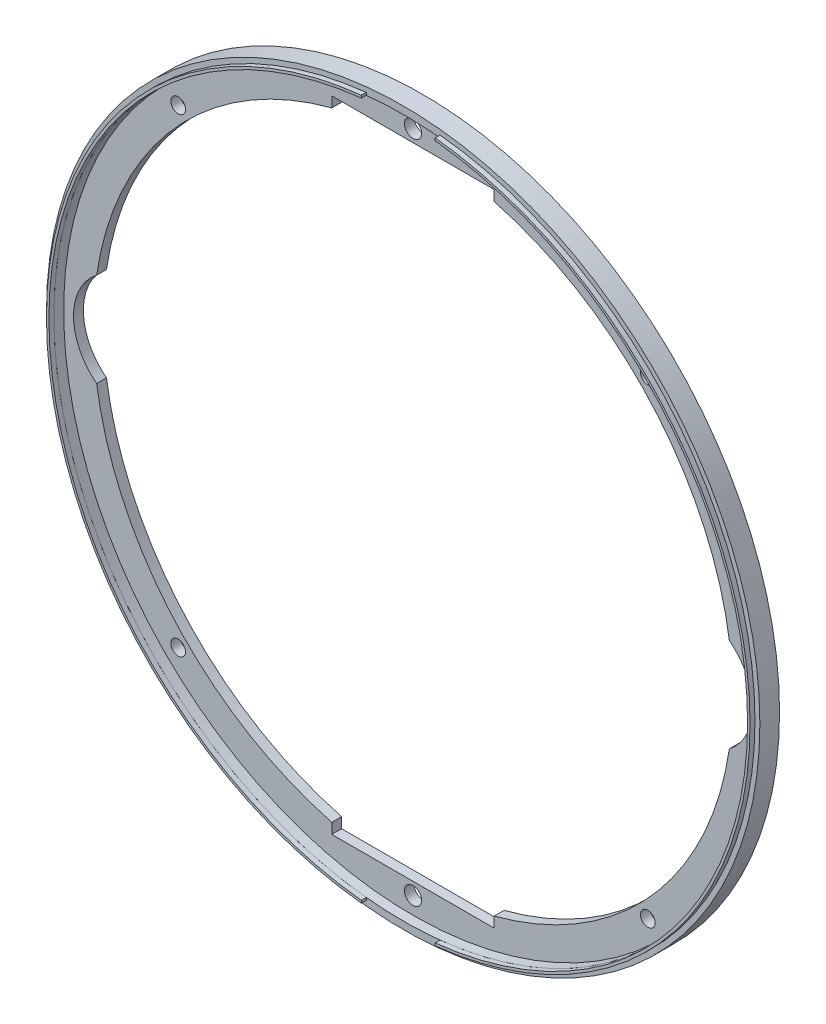
ISO-10303-21;
HEADER;
FILE_DESCRIPTION(('STEP AP214'),'2;1');
FILE_NAME('part.step','',(''),(''),'','','');
FILE_SCHEMA(('AUTOMOTIVE_DESIGN { 1 0 10303 214 1 1 1 1 }'));
ENDSEC;
DATA;
#1=APPLICATION_CONTEXT('core data for automotive mechanical design processes');
#2=APPLICATION_PROTOCOL_DEFINITION('international standard','automotive_design',2000,#1);
#3=PRODUCT_CONTEXT('',#1,'mechanical');
#4=PRODUCT('Part','Part','',(#3));
#5=PRODUCT_RELATED_PRODUCT_CATEGORY('part','',(#4));
#6=PRODUCT_DEFINITION_FORMATION('','',#4);
#7=PRODUCT_DEFINITION_CONTEXT('part definition',#1,'design');
#8=PRODUCT_DEFINITION('design','',#6,#7);
#9=PRODUCT_DEFINITION_SHAPE('','',#8);
#10=(LENGTH_UNIT() NAMED_UNIT(*) SI_UNIT(.MILLI.,.METRE.));
#11=(NAMED_UNIT(*) PLANE_ANGLE_UNIT() SI_UNIT($,.RADIAN.));
#12=(NAMED_UNIT(*) SI_UNIT($,.STERADIAN.) SOLID_ANGLE_UNIT());
#13=UNCERTAINTY_MEASURE_WITH_UNIT(LENGTH_MEASURE(1.E-05),#10,'distance_accuracy_value','');
#14=(GEOMETRIC_REPRESENTATION_CONTEXT(3) GLOBAL_UNCERTAINTY_ASSIGNED_CONTEXT((#13)) GLOBAL_UNIT_ASSIGNED_CONTEXT((#10,
#11,#12)) REPRESENTATION_CONTEXT('',''));
#15=CARTESIAN_POINT('',(0.,0.,0.));
#16=DIRECTION('',(0.,0.,1.));
#17=DIRECTION('',(1.,0.,0.));
#18=AXIS2_PLACEMENT_3D('',#15,#16,#17);
#19=CARTESIAN_POINT('',(0.,0.,5.));
#20=DIRECTION('',(0.,0.,1.));
#21=DIRECTION('',(1.,0.,0.));
#22=AXIS2_PLACEMENT_3D('',#19,#20,#21);
#23=PLANE('',#22);
#24=CARTESIAN_POINT('',(0.,0.,5.));
#25=DIRECTION('',(0.,0.,1.));
#26=DIRECTION('',(1.,0.,0.));
#27=AXIS2_PLACEMENT_3D('',#24,#25,#26);
#28=CIRCLE('',#27,71.5);
#29=CARTESIAN_POINT('',(-7.5,71.1055553385247,5.));
#30=VERTEX_POINT('',#29);
#31=CARTESIAN_POINT('',(-7.5,-71.1055553385247,5.));
#32=VERTEX_POINT('',#31);
#33=EDGE_CURVE('E138',#30,#32,#28,.T.);
#34=ORIENTED_EDGE('',*,*,#33,.T.);
#35=DIRECTION('',(0.,1.,0.));
#36=VECTOR('',#35,1.);
#37=CARTESIAN_POINT('',(-7.5,-72.5,5.));
#38=LINE('',#37,#36);
#39=CARTESIAN_POINT('',(-7.5,-70.6027619856334,5.));
#40=VERTEX_POINT('',#39);
#41=EDGE_CURVE('E91',#32,#40,#38,.T.);
#42=ORIENTED_EDGE('',*,*,#41,.T.);
#43=CARTESIAN_POINT('',(0.,0.,5.));
#44=DIRECTION('',(0.,0.,1.));
#45=DIRECTION('',(1.,0.,0.));
#46=AXIS2_PLACEMENT_3D('',#43,#44,#45);
#47=CIRCLE('',#46,71.);
#48=CARTESIAN_POINT('',(-7.5,70.6027619856334,5.));
#49=VERTEX_POINT('',#48);
#50=EDGE_CURVE('E130',#49,#40,#47,.T.);
#51=ORIENTED_EDGE('',*,*,#50,.F.);
#52=EDGE_CURVE('E111',#49,#30,#38,.T.);
#53=ORIENTED_EDGE('',*,*,#52,.T.);
#54=EDGE_LOOP('',(#34,#42,#51,#53));
#55=FACE_BOUND('',#54,.T.);
#56=ADVANCED_FACE('F74',(#55),#23,.T.);
#57=CARTESIAN_POINT('',(0.,0.,4.));
#58=DIRECTION('',(0.,0.,1.));
#59=DIRECTION('',(1.,0.,0.));
#60=AXIS2_PLACEMENT_3D('',#57,#58,#59);
#61=PLANE('',#60);
#62=DIRECTION('',(0.,-1.,0.));
#63=VECTOR('',#62,1.);
#64=CARTESIAN_POINT('',(-7.5,-72.5,4.));
#65=LINE('',#64,#63);
#66=CARTESIAN_POINT('',(-7.5,-70.6027619856334,4.));
#67=VERTEX_POINT('',#66);
#68=CARTESIAN_POINT('',(-7.5,-71.1055553385247,4.));
#69=VERTEX_POINT('',#68);
#70=EDGE_CURVE('E115',#67,#69,#65,.T.);
#71=ORIENTED_EDGE('',*,*,#70,.T.);
#72=CARTESIAN_POINT('',(0.,0.,4.));
#73=DIRECTION('',(0.,0.,1.));
#74=DIRECTION('',(1.,0.,0.));
#75=AXIS2_PLACEMENT_3D('',#72,#73,#74);
#76=CIRCLE('',#75,71.5);
#77=CARTESIAN_POINT('',(-7.5,71.1055553385247,4.));
#78=VERTEX_POINT('',#77);
#79=EDGE_CURVE('E133',#78,#69,#76,.T.);
#80=ORIENTED_EDGE('',*,*,#79,.F.);
#81=CARTESIAN_POINT('',(-7.5,70.6027619856334,4.));
#82=VERTEX_POINT('',#81);
#83=EDGE_CURVE('E123',#78,#82,#65,.T.);
#84=ORIENTED_EDGE('',*,*,#83,.T.);
#85=CARTESIAN_POINT('',(0.,0.,4.));
#86=DIRECTION('',(0.,0.,1.));
#87=DIRECTION('',(1.,0.,0.));
#88=AXIS2_PLACEMENT_3D('',#85,#86,#87);
#89=CIRCLE('',#88,71.);
#90=EDGE_CURVE('E77',#82,#67,#89,.T.);
#91=ORIENTED_EDGE('',*,*,#90,.T.);
#92=EDGE_LOOP('',(#71,#80,#84,#91));
#93=FACE_BOUND('',#92,.T.);
#94=ADVANCED_FACE('F132',(#93),#61,.F.);
#95=CARTESIAN_POINT('',(0.,0.,5.));
#96=DIRECTION('',(0.,0.,-1.));
#97=DIRECTION('',(-1.,0.,0.));
#98=AXIS2_PLACEMENT_3D('',#95,#96,#97);
#99=CYLINDRICAL_SURFACE('',#98,71.5);
#100=DIRECTION('',(0.,0.,-1.));
#101=VECTOR('',#100,1.);
#102=CARTESIAN_POINT('',(-7.5,-71.1055553385247,5.));
#103=LINE('',#102,#101);
#104=EDGE_CURVE('E13',#32,#69,#103,.T.);
#105=ORIENTED_EDGE('',*,*,#104,.F.);
#106=ORIENTED_EDGE('',*,*,#33,.F.);
#107=DIRECTION('',(0.,0.,-1.));
#108=VECTOR('',#107,1.);
#109=CARTESIAN_POINT('',(-7.5,71.1055553385247,5.));
#110=LINE('',#109,#108);
#111=EDGE_CURVE('E83',#78,#30,#110,.F.);
#112=ORIENTED_EDGE('',*,*,#111,.F.);
#113=ORIENTED_EDGE('',*,*,#79,.T.);
#114=EDGE_LOOP('',(#105,#106,#112,#113));
#115=FACE_BOUND('',#114,.T.);
#116=ADVANCED_FACE('F144',(#115),#99,.T.);
#117=CARTESIAN_POINT('',(0.,0.,5.));
#118=DIRECTION('',(0.,0.,-1.));
#119=DIRECTION('',(-1.,0.,0.));
#120=AXIS2_PLACEMENT_3D('',#117,#118,#119);
#121=CYLINDRICAL_SURFACE('',#120,71.);
#122=ORIENTED_EDGE('',*,*,#50,.T.);
#123=DIRECTION('',(0.,0.,-1.));
#124=VECTOR('',#123,1.);
#125=CARTESIAN_POINT('',(-7.5,-70.6027619856334,5.));
#126=LINE('',#125,#124);
#127=EDGE_CURVE('E118',#40,#67,#126,.T.);
#128=ORIENTED_EDGE('',*,*,#127,.T.);
#129=ORIENTED_EDGE('',*,*,#90,.F.);
#130=DIRECTION('',(0.,0.,-1.));
#131=VECTOR('',#130,1.);
#132=CARTESIAN_POINT('',(-7.5,70.6027619856334,5.));
#133=LINE('',#132,#131);
#134=EDGE_CURVE('E105',#82,#49,#133,.F.);
#135=ORIENTED_EDGE('',*,*,#134,.T.);
#136=EDGE_LOOP('',(#122,#128,#129,#135));
#137=FACE_BOUND('',#136,.T.);
#138=ADVANCED_FACE('F128',(#137),#121,.F.);
#139=CARTESIAN_POINT('',(-7.5,-72.5,-141.773797371133));
#140=DIRECTION('',(1.,0.,0.));
#141=DIRECTION('',(0.,0.,-1.));
#142=AXIS2_PLACEMENT_3D('',#139,#140,#141);
#143=PLANE('',#142);
#144=ORIENTED_EDGE('',*,*,#111,.T.);
#145=ORIENTED_EDGE('',*,*,#52,.F.);
#146=ORIENTED_EDGE('',*,*,#134,.F.);
#147=ORIENTED_EDGE('',*,*,#83,.F.);
#148=EDGE_LOOP('',(#144,#145,#146,#147));
#149=FACE_BOUND('',#148,.T.);
#150=ADVANCED_FACE('F146',(#149),#143,.T.);
#151=ORIENTED_EDGE('',*,*,#104,.T.);
#152=ORIENTED_EDGE('',*,*,#70,.F.);
#153=ORIENTED_EDGE('',*,*,#127,.F.);
#154=ORIENTED_EDGE('',*,*,#41,.F.);
#155=EDGE_LOOP('',(#151,#152,#153,#154));
#156=FACE_BOUND('',#155,.T.);
#157=ADVANCED_FACE('F117',(#156),#143,.T.);
#158=CLOSED_SHELL('',(#56,#94,#116,#138,#150,#157));
#159=MANIFOLD_SOLID_BREP('B2',#158);
#160=CARTESIAN_POINT('',(0.,0.,5.));
#161=DIRECTION('',(0.,0.,-1.));
#162=DIRECTION('',(-1.,0.,0.));
#163=AXIS2_PLACEMENT_3D('',#160,#161,#162);
#164=CYLINDRICAL_SURFACE('',#163,71.);
#165=DIRECTION('',(0.,0.,-1.));
#166=VECTOR('',#165,1.);
#167=CARTESIAN_POINT('',(7.5,-70.6027619856334,5.));
#168=LINE('',#167,#166);
#169=CARTESIAN_POINT('',(7.5,-70.6027619856334,5.));
#170=VERTEX_POINT('',#169);
#171=CARTESIAN_POINT('',(7.5,-70.6027619856334,4.));
#172=VERTEX_POINT('',#171);
#173=EDGE_CURVE('E72',#170,#172,#168,.T.);
#174=ORIENTED_EDGE('',*,*,#173,.F.);
#175=CARTESIAN_POINT('',(0.,0.,5.));
#176=DIRECTION('',(0.,0.,1.));
#177=DIRECTION('',(1.,0.,0.));
#178=AXIS2_PLACEMENT_3D('',#175,#176,#177);
#179=CIRCLE('',#178,71.);
#180=CARTESIAN_POINT('',(7.5,70.6027619856334,5.));
#181=VERTEX_POINT('',#180);
#182=EDGE_CURVE('E264',#170,#181,#179,.T.);
#183=ORIENTED_EDGE('',*,*,#182,.T.);
#184=DIRECTION('',(0.,0.,-1.));
#185=VECTOR('',#184,1.);
#186=CARTESIAN_POINT('',(7.5,70.6027619856334,5.));
#187=LINE('',#186,#185);
#188=CARTESIAN_POINT('',(7.5,70.6027619856334,4.));
#189=VERTEX_POINT('',#188);
#190=EDGE_CURVE('E212',#189,#181,#187,.F.);
#191=ORIENTED_EDGE('',*,*,#190,.F.);
#192=CARTESIAN_POINT('',(0.,0.,4.));
#193=DIRECTION('',(0.,0.,1.));
#194=DIRECTION('',(1.,0.,0.));
#195=AXIS2_PLACEMENT_3D('',#192,#193,#194);
#196=CIRCLE('',#195,71.);
#197=EDGE_CURVE('E259',#172,#189,#196,.T.);
#198=ORIENTED_EDGE('',*,*,#197,.F.);
#199=EDGE_LOOP('',(#174,#183,#191,#198));
#200=FACE_BOUND('',#199,.T.);
#201=ADVANCED_FACE('F204',(#200),#164,.F.);
#202=CARTESIAN_POINT('',(0.,0.,5.));
#203=DIRECTION('',(0.,0.,-1.));
#204=DIRECTION('',(-1.,0.,0.));
#205=AXIS2_PLACEMENT_3D('',#202,#203,#204);
#206=CYLINDRICAL_SURFACE('',#205,71.5);
#207=CARTESIAN_POINT('',(0.,0.,5.));
#208=DIRECTION('',(0.,0.,1.));
#209=DIRECTION('',(1.,0.,0.));
#210=AXIS2_PLACEMENT_3D('',#207,#208,#209);
#211=CIRCLE('',#210,71.5);
#212=CARTESIAN_POINT('',(7.5,-71.1055553385247,5.));
#213=VERTEX_POINT('',#212);
#214=CARTESIAN_POINT('',(7.5,71.1055553385247,5.));
#215=VERTEX_POINT('',#214);
#216=EDGE_CURVE('E263',#213,#215,#211,.T.);
#217=ORIENTED_EDGE('',*,*,#216,.F.);
#218=DIRECTION('',(0.,0.,-1.));
#219=VECTOR('',#218,1.);
#220=CARTESIAN_POINT('',(7.5,-71.1055553385247,5.));
#221=LINE('',#220,#219);
#222=CARTESIAN_POINT('',(7.5,-71.1055553385247,4.));
#223=VERTEX_POINT('',#222);
#224=EDGE_CURVE('E250',#213,#223,#221,.T.);
#225=ORIENTED_EDGE('',*,*,#224,.T.);
#226=CARTESIAN_POINT('',(0.,0.,4.));
#227=DIRECTION('',(0.,0.,1.));
#228=DIRECTION('',(1.,0.,0.));
#229=AXIS2_PLACEMENT_3D('',#226,#227,#228);
#230=CIRCLE('',#229,71.5);
#231=CARTESIAN_POINT('',(7.5,71.1055553385247,4.));
#232=VERTEX_POINT('',#231);
#233=EDGE_CURVE('E257',#223,#232,#230,.T.);
#234=ORIENTED_EDGE('',*,*,#233,.T.);
#235=DIRECTION('',(0.,0.,-1.));
#236=VECTOR('',#235,1.);
#237=CARTESIAN_POINT('',(7.5,71.1055553385247,5.));
#238=LINE('',#237,#236);
#239=EDGE_CURVE('E242',#232,#215,#238,.F.);
#240=ORIENTED_EDGE('',*,*,#239,.T.);
#241=EDGE_LOOP('',(#217,#225,#234,#240));
#242=FACE_BOUND('',#241,.T.);
#243=ADVANCED_FACE('F206',(#242),#206,.T.);
#244=CARTESIAN_POINT('',(0.,0.,4.));
#245=DIRECTION('',(0.,0.,1.));
#246=DIRECTION('',(1.,0.,0.));
#247=AXIS2_PLACEMENT_3D('',#244,#245,#246);
#248=PLANE('',#247);
#249=ORIENTED_EDGE('',*,*,#233,.F.);
#250=DIRECTION('',(0.,-1.,0.));
#251=VECTOR('',#250,1.);
#252=CARTESIAN_POINT('',(7.5,-72.5,4.));
#253=LINE('',#252,#251);
#254=EDGE_CURVE('E260',#172,#223,#253,.T.);
#255=ORIENTED_EDGE('',*,*,#254,.F.);
#256=ORIENTED_EDGE('',*,*,#197,.T.);
#257=EDGE_CURVE('E219',#232,#189,#253,.T.);
#258=ORIENTED_EDGE('',*,*,#257,.F.);
#259=EDGE_LOOP('',(#249,#255,#256,#258));
#260=FACE_BOUND('',#259,.T.);
#261=ADVANCED_FACE('F255',(#260),#248,.F.);
#262=CARTESIAN_POINT('',(0.,0.,5.));
#263=DIRECTION('',(0.,0.,1.));
#264=DIRECTION('',(1.,0.,0.));
#265=AXIS2_PLACEMENT_3D('',#262,#263,#264);
#266=PLANE('',#265);
#267=DIRECTION('',(0.,1.,0.));
#268=VECTOR('',#267,1.);
#269=CARTESIAN_POINT('',(7.5,-72.5,5.));
#270=LINE('',#269,#268);
#271=EDGE_CURVE('E226',#213,#170,#270,.T.);
#272=ORIENTED_EDGE('',*,*,#271,.F.);
#273=ORIENTED_EDGE('',*,*,#216,.T.);
#274=EDGE_CURVE('E245',#181,#215,#270,.T.);
#275=ORIENTED_EDGE('',*,*,#274,.F.);
#276=ORIENTED_EDGE('',*,*,#182,.F.);
#277=EDGE_LOOP('',(#272,#273,#275,#276));
#278=FACE_BOUND('',#277,.T.);
#279=ADVANCED_FACE('F273',(#278),#266,.T.);
#280=CARTESIAN_POINT('',(7.5,-72.5,-141.773797371133));
#281=DIRECTION('',(1.,0.,0.));
#282=DIRECTION('',(0.,0.,-1.));
#283=AXIS2_PLACEMENT_3D('',#280,#281,#282);
#284=PLANE('',#283);
#285=ORIENTED_EDGE('',*,*,#257,.T.);
#286=ORIENTED_EDGE('',*,*,#190,.T.);
#287=ORIENTED_EDGE('',*,*,#274,.T.);
#288=ORIENTED_EDGE('',*,*,#239,.F.);
#289=EDGE_LOOP('',(#285,#286,#287,#288));
#290=FACE_BOUND('',#289,.T.);
#291=ADVANCED_FACE('F243',(#290),#284,.F.);
#292=ORIENTED_EDGE('',*,*,#271,.T.);
#293=ORIENTED_EDGE('',*,*,#173,.T.);
#294=ORIENTED_EDGE('',*,*,#254,.T.);
#295=ORIENTED_EDGE('',*,*,#224,.F.);
#296=EDGE_LOOP('',(#292,#293,#294,#295));
#297=FACE_BOUND('',#296,.T.);
#298=ADVANCED_FACE('F275',(#297),#284,.F.);
#299=CLOSED_SHELL('',(#201,#243,#261,#279,#291,#298));
#300=MANIFOLD_SOLID_BREP('B7',#299);
#301=CARTESIAN_POINT('',(0.,0.,2.));
#302=DIRECTION('',(0.,0.,1.));
#303=DIRECTION('',(1.,0.,0.));
#304=AXIS2_PLACEMENT_3D('',#301,#302,#303);
#305=PLANE('',#304);
#306=CARTESIAN_POINT('',(0.,-67.5,2.));
#307=DIRECTION('',(0.,0.,1.));
#308=DIRECTION('',(1.,0.,0.));
#309=AXIS2_PLACEMENT_3D('',#306,#307,#308);
#310=CIRCLE('',#309,1.74999999999999);
#311=CARTESIAN_POINT('',(1.74999999999999,-67.5,2.));
#312=VERTEX_POINT('',#311);
#313=EDGE_CURVE('E626',#312,#312,#310,.T.);
#314=ORIENTED_EDGE('',*,*,#313,.F.);
#315=EDGE_LOOP('',(#314));
#316=FACE_BOUND('',#315,.T.);
#317=CARTESIAN_POINT('',(0.,67.5,2.));
#318=DIRECTION('',(0.,0.,1.));
#319=DIRECTION('',(1.,0.,0.));
#320=AXIS2_PLACEMENT_3D('',#317,#318,#319);
#321=CIRCLE('',#320,1.74999999999999);
#322=CARTESIAN_POINT('',(1.74999999999999,67.5,2.));
#323=VERTEX_POINT('',#322);
#324=EDGE_CURVE('E622',#323,#323,#321,.T.);
#325=ORIENTED_EDGE('',*,*,#324,.F.);
#326=EDGE_LOOP('',(#325));
#327=FACE_BOUND('',#326,.T.);
#328=CARTESIAN_POINT('',(0.,0.,2.));
#329=DIRECTION('',(0.,0.,1.));
#330=DIRECTION('',(1.,0.,0.));
#331=AXIS2_PLACEMENT_3D('',#328,#329,#330);
#332=CIRCLE('',#331,65.);
#333=CARTESIAN_POINT('',(16.5,-62.8708994686731,2.));
#334=VERTEX_POINT('',#333);
#335=CARTESIAN_POINT('',(64.2982456140351,-9.52552418280577,2.));
#336=VERTEX_POINT('',#335);
#337=EDGE_CURVE('E503',#334,#336,#332,.T.);
#338=ORIENTED_EDGE('',*,*,#337,.F.);
#339=DIRECTION('',(0.,1.,0.));
#340=VECTOR('',#339,1.);
#341=CARTESIAN_POINT('',(16.5,0.,2.));
#342=LINE('',#341,#340);
#343=CARTESIAN_POINT('',(16.5,-65.,2.));
#344=VERTEX_POINT('',#343);
#345=EDGE_CURVE('E423',#344,#334,#342,.T.);
#346=ORIENTED_EDGE('',*,*,#345,.F.);
#347=DIRECTION('',(-1.,0.,0.));
#348=VECTOR('',#347,1.);
#349=CARTESIAN_POINT('',(0.,-65.,2.));
#350=LINE('',#349,#348);
#351=CARTESIAN_POINT('',(-16.5,-65.,2.));
#352=VERTEX_POINT('',#351);
#353=EDGE_CURVE('E417',#344,#352,#350,.T.);
#354=ORIENTED_EDGE('',*,*,#353,.T.);
#355=DIRECTION('',(0.,1.,0.));
#356=VECTOR('',#355,1.);
#357=CARTESIAN_POINT('',(-16.5,0.,2.));
#358=LINE('',#357,#356);
#359=CARTESIAN_POINT('',(-16.5,-62.8708994686731,2.));
#360=VERTEX_POINT('',#359);
#361=EDGE_CURVE('E421',#352,#360,#358,.T.);
#362=ORIENTED_EDGE('',*,*,#361,.T.);
#363=CARTESIAN_POINT('',(-64.2982456140351,-9.52552418280577,2.));
#364=VERTEX_POINT('',#363);
#365=EDGE_CURVE('E504',#364,#360,#332,.T.);
#366=ORIENTED_EDGE('',*,*,#365,.F.);
#367=CARTESIAN_POINT('',(-57.,0.,2.));
#368=DIRECTION('',(0.,0.,1.));
#369=DIRECTION('',(1.,0.,0.));
#370=AXIS2_PLACEMENT_3D('',#367,#368,#369);
#371=CIRCLE('',#370,12.);
#372=CARTESIAN_POINT('',(-64.2982456140351,9.52552418280577,2.));
#373=VERTEX_POINT('',#372);
#374=EDGE_CURVE('E463',#373,#364,#371,.T.);
#375=ORIENTED_EDGE('',*,*,#374,.F.);
#376=CARTESIAN_POINT('',(-16.5,62.8708994686731,2.));
#377=VERTEX_POINT('',#376);
#378=EDGE_CURVE('E502',#377,#373,#332,.T.);
#379=ORIENTED_EDGE('',*,*,#378,.F.);
#380=CARTESIAN_POINT('',(-16.5,65.,2.));
#381=VERTEX_POINT('',#380);
#382=EDGE_CURVE('E348',#377,#381,#358,.T.);
#383=ORIENTED_EDGE('',*,*,#382,.T.);
#384=DIRECTION('',(-1.,0.,0.));
#385=VECTOR('',#384,1.);
#386=CARTESIAN_POINT('',(16.5,65.,2.));
#387=LINE('',#386,#385);
#388=CARTESIAN_POINT('',(16.5,65.,2.));
#389=VERTEX_POINT('',#388);
#390=EDGE_CURVE('E449',#389,#381,#387,.T.);
#391=ORIENTED_EDGE('',*,*,#390,.F.);
#392=CARTESIAN_POINT('',(16.5,62.8708994686731,2.));
#393=VERTEX_POINT('',#392);
#394=EDGE_CURVE('E447',#393,#389,#342,.T.);
#395=ORIENTED_EDGE('',*,*,#394,.F.);
#396=CARTESIAN_POINT('',(64.2982456140351,9.52552418280577,2.));
#397=VERTEX_POINT('',#396);
#398=EDGE_CURVE('E498',#397,#393,#332,.T.);
#399=ORIENTED_EDGE('',*,*,#398,.F.);
#400=CARTESIAN_POINT('',(57.,0.,2.));
#401=DIRECTION('',(0.,0.,1.));
#402=DIRECTION('',(1.,0.,0.));
#403=AXIS2_PLACEMENT_3D('',#400,#401,#402);
#404=CIRCLE('',#403,12.);
#405=EDGE_CURVE('E468',#336,#397,#404,.T.);
#406=ORIENTED_EDGE('',*,*,#405,.F.);
#407=EDGE_LOOP('',(#338,#346,#354,#362,#366,#375,#379,#383,#391,#395,#399,#406));
#408=FACE_BOUND('',#407,.T.);
#409=CARTESIAN_POINT('',(-47.729707730092,-47.729707730092,2.));
#410=DIRECTION('',(0.,0.,1.));
#411=DIRECTION('',(1.,0.,0.));
#412=AXIS2_PLACEMENT_3D('',#409,#410,#411);
#413=CIRCLE('',#412,1.5);
#414=CARTESIAN_POINT('',(-46.229707730092,-47.729707730092,2.));
#415=VERTEX_POINT('',#414);
#416=EDGE_CURVE('E491',#415,#415,#413,.T.);
#417=ORIENTED_EDGE('',*,*,#416,.F.);
#418=EDGE_LOOP('',(#417));
#419=FACE_BOUND('',#418,.T.);
#420=CARTESIAN_POINT('',(47.729707730092,-47.729707730092,2.));
#421=DIRECTION('',(0.,0.,1.));
#422=DIRECTION('',(1.,0.,0.));
#423=AXIS2_PLACEMENT_3D('',#420,#421,#422);
#424=CIRCLE('',#423,1.5);
#425=CARTESIAN_POINT('',(49.229707730092,-47.729707730092,2.));
#426=VERTEX_POINT('',#425);
#427=EDGE_CURVE('E485',#426,#426,#424,.T.);
#428=ORIENTED_EDGE('',*,*,#427,.F.);
#429=EDGE_LOOP('',(#428));
#430=FACE_BOUND('',#429,.T.);
#431=CARTESIAN_POINT('',(47.729707730092,47.729707730092,2.));
#432=DIRECTION('',(0.,0.,1.));
#433=DIRECTION('',(1.,0.,0.));
#434=AXIS2_PLACEMENT_3D('',#431,#432,#433);
#435=CIRCLE('',#434,1.5);
#436=CARTESIAN_POINT('',(49.229707730092,47.729707730092,2.));
#437=VERTEX_POINT('',#436);
#438=EDGE_CURVE('E479',#437,#437,#435,.T.);
#439=ORIENTED_EDGE('',*,*,#438,.F.);
#440=EDGE_LOOP('',(#439));
#441=FACE_BOUND('',#440,.T.);
#442=CARTESIAN_POINT('',(-47.729707730092,47.729707730092,2.));
#443=DIRECTION('',(0.,0.,1.));
#444=DIRECTION('',(1.,0.,0.));
#445=AXIS2_PLACEMENT_3D('',#442,#443,#444);
#446=CIRCLE('',#445,1.5);
#447=CARTESIAN_POINT('',(-46.229707730092,47.729707730092,2.));
#448=VERTEX_POINT('',#447);
#449=EDGE_CURVE('E467',#448,#448,#446,.T.);
#450=ORIENTED_EDGE('',*,*,#449,.F.);
#451=EDGE_LOOP('',(#450));
#452=FACE_BOUND('',#451,.T.);
#453=CARTESIAN_POINT('',(0.,0.,2.));
#454=DIRECTION('',(0.,0.,1.));
#455=DIRECTION('',(1.,0.,0.));
#456=AXIS2_PLACEMENT_3D('',#453,#454,#455);
#457=CIRCLE('',#456,71.);
#458=CARTESIAN_POINT('',(71.,0.,2.));
#459=VERTEX_POINT('',#458);
#460=EDGE_CURVE('E202',#459,#459,#457,.F.);
#461=ORIENTED_EDGE('',*,*,#460,.F.);
#462=EDGE_LOOP('',(#461));
#463=FACE_BOUND('',#462,.T.);
#464=ADVANCED_FACE('F325',(#316,#327,#408,#419,#430,#441,#452,#463),#305,.T.);
#465=CARTESIAN_POINT('',(0.,0.,2.));
#466=DIRECTION('',(0.,0.,-1.));
#467=DIRECTION('',(-1.,0.,0.));
#468=AXIS2_PLACEMENT_3D('',#465,#466,#467);
#469=CYLINDRICAL_SURFACE('',#468,65.);
#470=CARTESIAN_POINT('',(0.,0.,0.));
#471=DIRECTION('',(0.,0.,1.));
#472=DIRECTION('',(1.,0.,0.));
#473=AXIS2_PLACEMENT_3D('',#470,#471,#472);
#474=CIRCLE('',#473,65.);
#475=CARTESIAN_POINT('',(16.5,-62.8708994686731,0.));
#476=VERTEX_POINT('',#475);
#477=CARTESIAN_POINT('',(64.2982456140351,-9.52552418280577,0.));
#478=VERTEX_POINT('',#477);
#479=EDGE_CURVE('E497',#476,#478,#474,.T.);
#480=ORIENTED_EDGE('',*,*,#479,.F.);
#481=DIRECTION('',(0.,0.,-1.));
#482=VECTOR('',#481,1.);
#483=CARTESIAN_POINT('',(16.5,-62.8708994686731,2.));
#484=LINE('',#483,#482);
#485=EDGE_CURVE('E460',#476,#334,#484,.F.);
#486=ORIENTED_EDGE('',*,*,#485,.T.);
#487=ORIENTED_EDGE('',*,*,#337,.T.);
#488=DIRECTION('',(0.,0.,1.));
#489=VECTOR('',#488,1.);
#490=CARTESIAN_POINT('',(64.2982456140351,-9.52552418280577,1.));
#491=LINE('',#490,#489);
#492=EDGE_CURVE('E519',#478,#336,#491,.T.);
#493=ORIENTED_EDGE('',*,*,#492,.F.);
#494=EDGE_LOOP('',(#480,#486,#487,#493));
#495=FACE_BOUND('',#494,.T.);
#496=ADVANCED_FACE('F541',(#495),#469,.F.);
#497=CARTESIAN_POINT('',(0.,0.,0.));
#498=DIRECTION('',(0.,0.,1.));
#499=DIRECTION('',(1.,0.,0.));
#500=AXIS2_PLACEMENT_3D('',#497,#498,#499);
#501=PLANE('',#500);
#502=CARTESIAN_POINT('',(0.,-67.5,0.));
#503=DIRECTION('',(0.,0.,1.));
#504=DIRECTION('',(1.,0.,0.));
#505=AXIS2_PLACEMENT_3D('',#502,#503,#504);
#506=CIRCLE('',#505,1.75);
#507=CARTESIAN_POINT('',(1.75,-67.5,0.));
#508=VERTEX_POINT('',#507);
#509=EDGE_CURVE('E597',#508,#508,#506,.T.);
#510=ORIENTED_EDGE('',*,*,#509,.T.);
#511=EDGE_LOOP('',(#510));
#512=FACE_BOUND('',#511,.T.);
#513=CARTESIAN_POINT('',(0.,67.5,0.));
#514=DIRECTION('',(0.,0.,1.));
#515=DIRECTION('',(1.,0.,0.));
#516=AXIS2_PLACEMENT_3D('',#513,#514,#515);
#517=CIRCLE('',#516,1.75);
#518=CARTESIAN_POINT('',(1.75,67.5,0.));
#519=VERTEX_POINT('',#518);
#520=EDGE_CURVE('E601',#519,#519,#517,.T.);
#521=ORIENTED_EDGE('',*,*,#520,.T.);
#522=EDGE_LOOP('',(#521));
#523=FACE_BOUND('',#522,.T.);
#524=CARTESIAN_POINT('',(-47.729707730092,47.729707730092,0.));
#525=DIRECTION('',(0.,0.,1.));
#526=DIRECTION('',(1.,0.,0.));
#527=AXIS2_PLACEMENT_3D('',#524,#525,#526);
#528=CIRCLE('',#527,1.5);
#529=CARTESIAN_POINT('',(-46.229707730092,47.729707730092,0.));
#530=VERTEX_POINT('',#529);
#531=EDGE_CURVE('E476',#530,#530,#528,.T.);
#532=ORIENTED_EDGE('',*,*,#531,.T.);
#533=EDGE_LOOP('',(#532));
#534=FACE_BOUND('',#533,.T.);
#535=CARTESIAN_POINT('',(47.729707730092,47.729707730092,0.));
#536=DIRECTION('',(0.,0.,1.));
#537=DIRECTION('',(1.,0.,0.));
#538=AXIS2_PLACEMENT_3D('',#535,#536,#537);
#539=CIRCLE('',#538,1.5);
#540=CARTESIAN_POINT('',(49.229707730092,47.729707730092,0.));
#541=VERTEX_POINT('',#540);
#542=EDGE_CURVE('E482',#541,#541,#539,.T.);
#543=ORIENTED_EDGE('',*,*,#542,.T.);
#544=EDGE_LOOP('',(#543));
#545=FACE_BOUND('',#544,.T.);
#546=CARTESIAN_POINT('',(47.729707730092,-47.729707730092,0.));
#547=DIRECTION('',(0.,0.,1.));
#548=DIRECTION('',(1.,0.,0.));
#549=AXIS2_PLACEMENT_3D('',#546,#547,#548);
#550=CIRCLE('',#549,1.5);
#551=CARTESIAN_POINT('',(49.229707730092,-47.729707730092,0.));
#552=VERTEX_POINT('',#551);
#553=EDGE_CURVE('E488',#552,#552,#550,.T.);
#554=ORIENTED_EDGE('',*,*,#553,.T.);
#555=EDGE_LOOP('',(#554));
#556=FACE_BOUND('',#555,.T.);
#557=CARTESIAN_POINT('',(-47.729707730092,-47.729707730092,0.));
#558=DIRECTION('',(0.,0.,1.));
#559=DIRECTION('',(1.,0.,0.));
#560=AXIS2_PLACEMENT_3D('',#557,#558,#559);
#561=CIRCLE('',#560,1.5);
#562=CARTESIAN_POINT('',(-46.229707730092,-47.729707730092,0.));
#563=VERTEX_POINT('',#562);
#564=EDGE_CURVE('E494',#563,#563,#561,.T.);
#565=ORIENTED_EDGE('',*,*,#564,.T.);
#566=EDGE_LOOP('',(#565));
#567=FACE_BOUND('',#566,.T.);
#568=CARTESIAN_POINT('',(0.,0.,0.));
#569=DIRECTION('',(0.,0.,1.));
#570=DIRECTION('',(1.,0.,0.));
#571=AXIS2_PLACEMENT_3D('',#568,#569,#570);
#572=CIRCLE('',#571,72.5);
#573=CARTESIAN_POINT('',(72.5,0.,0.));
#574=VERTEX_POINT('',#573);
#575=EDGE_CURVE('E501',#574,#574,#572,.T.);
#576=ORIENTED_EDGE('',*,*,#575,.F.);
#577=EDGE_LOOP('',(#576));
#578=FACE_BOUND('',#577,.T.);
#579=DIRECTION('',(0.,1.,0.));
#580=VECTOR('',#579,1.);
#581=CARTESIAN_POINT('',(16.5,0.,0.));
#582=LINE('',#581,#580);
#583=CARTESIAN_POINT('',(16.5,-65.,0.));
#584=VERTEX_POINT('',#583);
#585=EDGE_CURVE('E439',#584,#476,#582,.T.);
#586=ORIENTED_EDGE('',*,*,#585,.T.);
#587=ORIENTED_EDGE('',*,*,#479,.T.);
#588=CARTESIAN_POINT('',(57.,0.,0.));
#589=DIRECTION('',(0.,0.,1.));
#590=DIRECTION('',(1.,0.,0.));
#591=AXIS2_PLACEMENT_3D('',#588,#589,#590);
#592=CIRCLE('',#591,12.);
#593=CARTESIAN_POINT('',(64.2982456140351,9.52552418280577,0.));
#594=VERTEX_POINT('',#593);
#595=EDGE_CURVE('E464',#478,#594,#592,.T.);
#596=ORIENTED_EDGE('',*,*,#595,.T.);
#597=CARTESIAN_POINT('',(16.5,62.8708994686731,0.));
#598=VERTEX_POINT('',#597);
#599=EDGE_CURVE('E505',#594,#598,#474,.T.);
#600=ORIENTED_EDGE('',*,*,#599,.T.);
#601=CARTESIAN_POINT('',(16.5,65.,0.));
#602=VERTEX_POINT('',#601);
#603=EDGE_CURVE('E443',#598,#602,#582,.T.);
#604=ORIENTED_EDGE('',*,*,#603,.T.);
#605=DIRECTION('',(-1.,0.,0.));
#606=VECTOR('',#605,1.);
#607=CARTESIAN_POINT('',(16.5,65.,0.));
#608=LINE('',#607,#606);
#609=CARTESIAN_POINT('',(-16.5,65.,0.));
#610=VERTEX_POINT('',#609);
#611=EDGE_CURVE('E452',#602,#610,#608,.T.);
#612=ORIENTED_EDGE('',*,*,#611,.T.);
#613=DIRECTION('',(0.,1.,0.));
#614=VECTOR('',#613,1.);
#615=CARTESIAN_POINT('',(-16.5,0.,0.));
#616=LINE('',#615,#614);
#617=CARTESIAN_POINT('',(-16.5,62.8708994686731,0.));
#618=VERTEX_POINT('',#617);
#619=EDGE_CURVE('E442',#618,#610,#616,.T.);
#620=ORIENTED_EDGE('',*,*,#619,.F.);
#621=CARTESIAN_POINT('',(-64.2982456140351,9.52552418280577,0.));
#622=VERTEX_POINT('',#621);
#623=EDGE_CURVE('E508',#618,#622,#474,.T.);
#624=ORIENTED_EDGE('',*,*,#623,.T.);
#625=CARTESIAN_POINT('',(-57.,0.,0.));
#626=DIRECTION('',(0.,0.,1.));
#627=DIRECTION('',(1.,0.,0.));
#628=AXIS2_PLACEMENT_3D('',#625,#626,#627);
#629=CIRCLE('',#628,12.);
#630=CARTESIAN_POINT('',(-64.2982456140351,-9.52552418280577,0.));
#631=VERTEX_POINT('',#630);
#632=EDGE_CURVE('E470',#622,#631,#629,.T.);
#633=ORIENTED_EDGE('',*,*,#632,.T.);
#634=CARTESIAN_POINT('',(-16.5,-62.8708994686731,0.));
#635=VERTEX_POINT('',#634);
#636=EDGE_CURVE('E509',#631,#635,#474,.T.);
#637=ORIENTED_EDGE('',*,*,#636,.T.);
#638=CARTESIAN_POINT('',(-16.5,-65.,0.));
#639=VERTEX_POINT('',#638);
#640=EDGE_CURVE('E444',#639,#635,#616,.T.);
#641=ORIENTED_EDGE('',*,*,#640,.F.);
#642=DIRECTION('',(-1.,0.,0.));
#643=VECTOR('',#642,1.);
#644=CARTESIAN_POINT('',(0.,-65.,0.));
#645=LINE('',#644,#643);
#646=EDGE_CURVE('E429',#584,#639,#645,.T.);
#647=ORIENTED_EDGE('',*,*,#646,.F.);
#648=EDGE_LOOP('',(#586,#587,#596,#600,#604,#612,#620,#624,#633,#637,#641,#647));
#649=FACE_BOUND('',#648,.T.);
#650=ADVANCED_FACE('F533',(#512,#523,#534,#545,#556,#567,#578,#649),#501,.F.);
#651=ORIENTED_EDGE('',*,*,#398,.T.);
#652=DIRECTION('',(0.,0.,-1.));
#653=VECTOR('',#652,1.);
#654=CARTESIAN_POINT('',(16.5,62.8708994686731,2.));
#655=LINE('',#654,#653);
#656=EDGE_CURVE('E333',#393,#598,#655,.T.);
#657=ORIENTED_EDGE('',*,*,#656,.T.);
#658=ORIENTED_EDGE('',*,*,#599,.F.);
#659=DIRECTION('',(0.,0.,1.));
#660=VECTOR('',#659,1.);
#661=CARTESIAN_POINT('',(64.2982456140351,9.52552418280577,1.));
#662=LINE('',#661,#660);
#663=EDGE_CURVE('E517',#397,#594,#662,.F.);
#664=ORIENTED_EDGE('',*,*,#663,.F.);
#665=EDGE_LOOP('',(#651,#657,#658,#664));
#666=FACE_BOUND('',#665,.T.);
#667=ADVANCED_FACE('F526',(#666),#469,.F.);
#668=DIRECTION('',(0.,0.,-1.));
#669=VECTOR('',#668,1.);
#670=CARTESIAN_POINT('',(-16.5,-62.8708994686731,2.));
#671=LINE('',#670,#669);
#672=EDGE_CURVE('E431',#635,#360,#671,.F.);
#673=ORIENTED_EDGE('',*,*,#672,.F.);
#674=ORIENTED_EDGE('',*,*,#636,.F.);
#675=DIRECTION('',(0.,0.,1.));
#676=VECTOR('',#675,1.);
#677=CARTESIAN_POINT('',(-64.2982456140351,-9.52552418280577,1.));
#678=LINE('',#677,#676);
#679=EDGE_CURVE('E512',#364,#631,#678,.F.);
#680=ORIENTED_EDGE('',*,*,#679,.F.);
#681=ORIENTED_EDGE('',*,*,#365,.T.);
#682=EDGE_LOOP('',(#673,#674,#680,#681));
#683=FACE_BOUND('',#682,.T.);
#684=ADVANCED_FACE('F553',(#683),#469,.F.);
#685=CARTESIAN_POINT('',(0.,0.,2.));
#686=DIRECTION('',(0.,0.,-1.));
#687=DIRECTION('',(-1.,0.,0.));
#688=AXIS2_PLACEMENT_3D('',#685,#686,#687);
#689=CYLINDRICAL_SURFACE('',#688,72.5);
#690=ORIENTED_EDGE('',*,*,#575,.T.);
#691=EDGE_LOOP('',(#690));
#692=FACE_BOUND('',#691,.T.);
#693=CARTESIAN_POINT('',(0.,0.,4.));
#694=DIRECTION('',(0.,0.,1.));
#695=DIRECTION('',(1.,0.,0.));
#696=AXIS2_PLACEMENT_3D('',#693,#694,#695);
#697=CIRCLE('',#696,72.5);
#698=CARTESIAN_POINT('',(72.5,0.,4.));
#699=VERTEX_POINT('',#698);
#700=EDGE_CURVE('E454',#699,#699,#697,.T.);
#701=ORIENTED_EDGE('',*,*,#700,.F.);
#702=EDGE_LOOP('',(#701));
#703=FACE_BOUND('',#702,.T.);
#704=ADVANCED_FACE('F327',(#692,#703),#689,.T.);
#705=DIRECTION('',(0.,0.,-1.));
#706=VECTOR('',#705,1.);
#707=CARTESIAN_POINT('',(-16.5,62.8708994686731,2.));
#708=LINE('',#707,#706);
#709=EDGE_CURVE('E522',#377,#618,#708,.T.);
#710=ORIENTED_EDGE('',*,*,#709,.F.);
#711=ORIENTED_EDGE('',*,*,#378,.T.);
#712=DIRECTION('',(0.,0.,1.));
#713=VECTOR('',#712,1.);
#714=CARTESIAN_POINT('',(-64.2982456140351,9.52552418280577,1.));
#715=LINE('',#714,#713);
#716=EDGE_CURVE('E514',#622,#373,#715,.T.);
#717=ORIENTED_EDGE('',*,*,#716,.F.);
#718=ORIENTED_EDGE('',*,*,#623,.F.);
#719=EDGE_LOOP('',(#710,#711,#717,#718));
#720=FACE_BOUND('',#719,.T.);
#721=ADVANCED_FACE('F545',(#720),#469,.F.);
#722=CARTESIAN_POINT('',(-47.729707730092,-47.729707730092,2.));
#723=DIRECTION('',(0.,0.,1.));
#724=DIRECTION('',(1.,0.,0.));
#725=AXIS2_PLACEMENT_3D('',#722,#723,#724);
#726=CYLINDRICAL_SURFACE('',#725,1.5);
#727=ORIENTED_EDGE('',*,*,#564,.F.);
#728=EDGE_LOOP('',(#727));
#729=FACE_BOUND('',#728,.T.);
#730=ORIENTED_EDGE('',*,*,#416,.T.);
#731=EDGE_LOOP('',(#730));
#732=FACE_BOUND('',#731,.T.);
#733=ADVANCED_FACE('F666',(#729,#732),#726,.F.);
#734=CARTESIAN_POINT('',(47.729707730092,-47.729707730092,2.));
#735=DIRECTION('',(0.,0.,1.));
#736=DIRECTION('',(1.,0.,0.));
#737=AXIS2_PLACEMENT_3D('',#734,#735,#736);
#738=CYLINDRICAL_SURFACE('',#737,1.5);
#739=ORIENTED_EDGE('',*,*,#553,.F.);
#740=EDGE_LOOP('',(#739));
#741=FACE_BOUND('',#740,.T.);
#742=ORIENTED_EDGE('',*,*,#427,.T.);
#743=EDGE_LOOP('',(#742));
#744=FACE_BOUND('',#743,.T.);
#745=ADVANCED_FACE('F663',(#741,#744),#738,.F.);
#746=CARTESIAN_POINT('',(47.729707730092,47.729707730092,2.));
#747=DIRECTION('',(0.,0.,1.));
#748=DIRECTION('',(1.,0.,0.));
#749=AXIS2_PLACEMENT_3D('',#746,#747,#748);
#750=CYLINDRICAL_SURFACE('',#749,1.5);
#751=ORIENTED_EDGE('',*,*,#542,.F.);
#752=EDGE_LOOP('',(#751));
#753=FACE_BOUND('',#752,.T.);
#754=ORIENTED_EDGE('',*,*,#438,.T.);
#755=EDGE_LOOP('',(#754));
#756=FACE_BOUND('',#755,.T.);
#757=ADVANCED_FACE('F659',(#753,#756),#750,.F.);
#758=CARTESIAN_POINT('',(-47.729707730092,47.729707730092,2.));
#759=DIRECTION('',(0.,0.,1.));
#760=DIRECTION('',(1.,0.,0.));
#761=AXIS2_PLACEMENT_3D('',#758,#759,#760);
#762=CYLINDRICAL_SURFACE('',#761,1.5);
#763=ORIENTED_EDGE('',*,*,#531,.F.);
#764=EDGE_LOOP('',(#763));
#765=FACE_BOUND('',#764,.T.);
#766=ORIENTED_EDGE('',*,*,#449,.T.);
#767=EDGE_LOOP('',(#766));
#768=FACE_BOUND('',#767,.T.);
#769=ADVANCED_FACE('F654',(#765,#768),#762,.F.);
#770=CARTESIAN_POINT('',(-57.,0.,0.));
#771=DIRECTION('',(0.,0.,1.));
#772=DIRECTION('',(1.,0.,0.));
#773=AXIS2_PLACEMENT_3D('',#770,#771,#772);
#774=CYLINDRICAL_SURFACE('',#773,12.);
#775=ORIENTED_EDGE('',*,*,#716,.T.);
#776=ORIENTED_EDGE('',*,*,#374,.T.);
#777=ORIENTED_EDGE('',*,*,#679,.T.);
#778=ORIENTED_EDGE('',*,*,#632,.F.);
#779=EDGE_LOOP('',(#775,#776,#777,#778));
#780=FACE_BOUND('',#779,.T.);
#781=ADVANCED_FACE('F550',(#780),#774,.F.);
#782=CARTESIAN_POINT('',(57.,0.,0.));
#783=DIRECTION('',(0.,0.,1.));
#784=DIRECTION('',(1.,0.,0.));
#785=AXIS2_PLACEMENT_3D('',#782,#783,#784);
#786=CYLINDRICAL_SURFACE('',#785,12.);
#787=ORIENTED_EDGE('',*,*,#492,.T.);
#788=ORIENTED_EDGE('',*,*,#405,.T.);
#789=ORIENTED_EDGE('',*,*,#663,.T.);
#790=ORIENTED_EDGE('',*,*,#595,.F.);
#791=EDGE_LOOP('',(#787,#788,#789,#790));
#792=FACE_BOUND('',#791,.T.);
#793=ADVANCED_FACE('F538',(#792),#786,.F.);
#794=CARTESIAN_POINT('',(-16.5,0.,2.));
#795=DIRECTION('',(-1.,0.,0.));
#796=DIRECTION('',(0.,0.,1.));
#797=AXIS2_PLACEMENT_3D('',#794,#795,#796);
#798=PLANE('',#797);
#799=ORIENTED_EDGE('',*,*,#709,.T.);
#800=ORIENTED_EDGE('',*,*,#619,.T.);
#801=DIRECTION('',(0.,0.,-1.));
#802=VECTOR('',#801,1.);
#803=CARTESIAN_POINT('',(-16.5,65.,2.));
#804=LINE('',#803,#802);
#805=EDGE_CURVE('E456',#381,#610,#804,.T.);
#806=ORIENTED_EDGE('',*,*,#805,.F.);
#807=ORIENTED_EDGE('',*,*,#382,.F.);
#808=EDGE_LOOP('',(#799,#800,#806,#807));
#809=FACE_BOUND('',#808,.T.);
#810=ADVANCED_FACE('F559',(#809),#798,.F.);
#811=CARTESIAN_POINT('',(16.5,0.,2.));
#812=DIRECTION('',(-1.,0.,0.));
#813=DIRECTION('',(0.,0.,1.));
#814=AXIS2_PLACEMENT_3D('',#811,#812,#813);
#815=PLANE('',#814);
#816=ORIENTED_EDGE('',*,*,#394,.T.);
#817=DIRECTION('',(0.,0.,-1.));
#818=VECTOR('',#817,1.);
#819=CARTESIAN_POINT('',(16.5,65.,2.));
#820=LINE('',#819,#818);
#821=EDGE_CURVE('E451',#389,#602,#820,.T.);
#822=ORIENTED_EDGE('',*,*,#821,.T.);
#823=ORIENTED_EDGE('',*,*,#603,.F.);
#824=ORIENTED_EDGE('',*,*,#656,.F.);
#825=EDGE_LOOP('',(#816,#822,#823,#824));
#826=FACE_BOUND('',#825,.T.);
#827=ADVANCED_FACE('F569',(#826),#815,.T.);
#828=CARTESIAN_POINT('',(16.5,65.,2.));
#829=DIRECTION('',(0.,-1.,0.));
#830=DIRECTION('',(0.,0.,-1.));
#831=AXIS2_PLACEMENT_3D('',#828,#829,#830);
#832=PLANE('',#831);
#833=ORIENTED_EDGE('',*,*,#390,.T.);
#834=ORIENTED_EDGE('',*,*,#805,.T.);
#835=ORIENTED_EDGE('',*,*,#611,.F.);
#836=ORIENTED_EDGE('',*,*,#821,.F.);
#837=EDGE_LOOP('',(#833,#834,#835,#836));
#838=FACE_BOUND('',#837,.T.);
#839=ADVANCED_FACE('F561',(#838),#832,.T.);
#840=CARTESIAN_POINT('',(0.,-65.,2.));
#841=DIRECTION('',(0.,-1.,0.));
#842=DIRECTION('',(0.,0.,-1.));
#843=AXIS2_PLACEMENT_3D('',#840,#841,#842);
#844=PLANE('',#843);
#845=ORIENTED_EDGE('',*,*,#353,.F.);
#846=DIRECTION('',(0.,0.,-1.));
#847=VECTOR('',#846,1.);
#848=CARTESIAN_POINT('',(16.5,-65.,2.));
#849=LINE('',#848,#847);
#850=EDGE_CURVE('E426',#344,#584,#849,.T.);
#851=ORIENTED_EDGE('',*,*,#850,.T.);
#852=ORIENTED_EDGE('',*,*,#646,.T.);
#853=DIRECTION('',(0.,0.,-1.));
#854=VECTOR('',#853,1.);
#855=CARTESIAN_POINT('',(-16.5,-65.,2.));
#856=LINE('',#855,#854);
#857=EDGE_CURVE('E340',#352,#639,#856,.T.);
#858=ORIENTED_EDGE('',*,*,#857,.F.);
#859=EDGE_LOOP('',(#845,#851,#852,#858));
#860=FACE_BOUND('',#859,.T.);
#861=ADVANCED_FACE('F428',(#860),#844,.F.);
#862=ORIENTED_EDGE('',*,*,#585,.F.);
#863=ORIENTED_EDGE('',*,*,#850,.F.);
#864=ORIENTED_EDGE('',*,*,#345,.T.);
#865=ORIENTED_EDGE('',*,*,#485,.F.);
#866=EDGE_LOOP('',(#862,#863,#864,#865));
#867=FACE_BOUND('',#866,.T.);
#868=ADVANCED_FACE('F566',(#867),#815,.T.);
#869=ORIENTED_EDGE('',*,*,#672,.T.);
#870=ORIENTED_EDGE('',*,*,#361,.F.);
#871=ORIENTED_EDGE('',*,*,#857,.T.);
#872=ORIENTED_EDGE('',*,*,#640,.T.);
#873=EDGE_LOOP('',(#869,#870,#871,#872));
#874=FACE_BOUND('',#873,.T.);
#875=ADVANCED_FACE('F433',(#874),#798,.F.);
#876=CARTESIAN_POINT('',(0.,0.,4.));
#877=DIRECTION('',(0.,0.,1.));
#878=DIRECTION('',(1.,0.,0.));
#879=AXIS2_PLACEMENT_3D('',#876,#877,#878);
#880=PLANE('',#879);
#881=CARTESIAN_POINT('',(0.,0.,4.));
#882=DIRECTION('',(0.,0.,1.));
#883=DIRECTION('',(1.,0.,0.));
#884=AXIS2_PLACEMENT_3D('',#881,#882,#883);
#885=CIRCLE('',#884,71.);
#886=CARTESIAN_POINT('',(71.,0.,4.));
#887=VERTEX_POINT('',#886);
#888=EDGE_CURVE('E617',#887,#887,#885,.T.);
#889=ORIENTED_EDGE('',*,*,#888,.F.);
#890=EDGE_LOOP('',(#889));
#891=FACE_BOUND('',#890,.T.);
#892=ORIENTED_EDGE('',*,*,#700,.T.);
#893=EDGE_LOOP('',(#892));
#894=FACE_BOUND('',#893,.T.);
#895=ADVANCED_FACE('F574',(#891,#894),#880,.T.);
#896=CARTESIAN_POINT('',(0.,0.,4.));
#897=DIRECTION('',(0.,0.,-1.));
#898=DIRECTION('',(-1.,0.,0.));
#899=AXIS2_PLACEMENT_3D('',#896,#897,#898);
#900=CYLINDRICAL_SURFACE('',#899,71.);
#901=ORIENTED_EDGE('',*,*,#888,.T.);
#902=EDGE_LOOP('',(#901));
#903=FACE_BOUND('',#902,.T.);
#904=ORIENTED_EDGE('',*,*,#460,.T.);
#905=EDGE_LOOP('',(#904));
#906=FACE_BOUND('',#905,.T.);
#907=ADVANCED_FACE('F637',(#903,#906),#900,.F.);
#908=CARTESIAN_POINT('',(0.,67.5,2.));
#909=DIRECTION('',(0.,0.,1.));
#910=DIRECTION('',(1.,0.,0.));
#911=AXIS2_PLACEMENT_3D('',#908,#909,#910);
#912=CYLINDRICAL_SURFACE('',#911,1.74999999999999);
#913=ORIENTED_EDGE('',*,*,#520,.F.);
#914=EDGE_LOOP('',(#913));
#915=FACE_BOUND('',#914,.T.);
#916=ORIENTED_EDGE('',*,*,#324,.T.);
#917=EDGE_LOOP('',(#916));
#918=FACE_BOUND('',#917,.T.);
#919=ADVANCED_FACE('F631',(#915,#918),#912,.F.);
#920=CARTESIAN_POINT('',(0.,-67.5,2.));
#921=DIRECTION('',(0.,0.,1.));
#922=DIRECTION('',(1.,0.,0.));
#923=AXIS2_PLACEMENT_3D('',#920,#921,#922);
#924=CYLINDRICAL_SURFACE('',#923,1.74999999999999);
#925=ORIENTED_EDGE('',*,*,#509,.F.);
#926=EDGE_LOOP('',(#925));
#927=FACE_BOUND('',#926,.T.);
#928=ORIENTED_EDGE('',*,*,#313,.T.);
#929=EDGE_LOOP('',(#928));
#930=FACE_BOUND('',#929,.T.);
#931=ADVANCED_FACE('F629',(#927,#930),#924,.F.);
#932=CLOSED_SHELL('',(#464,#496,#650,#667,#684,#704,#721,#733,#745,#757,#769,#781,#793,#810,
#827,#839,#861,#868,#875,#895,#907,#919,#931));
#933=MANIFOLD_SOLID_BREP('B66',#932);
#934=ADVANCED_BREP_SHAPE_REPRESENTATION('',(#18,#159,#300,#933),#14);
#935=SHAPE_DEFINITION_REPRESENTATION(#9,#934);
ENDSEC;
END-ISO-10303-21;
